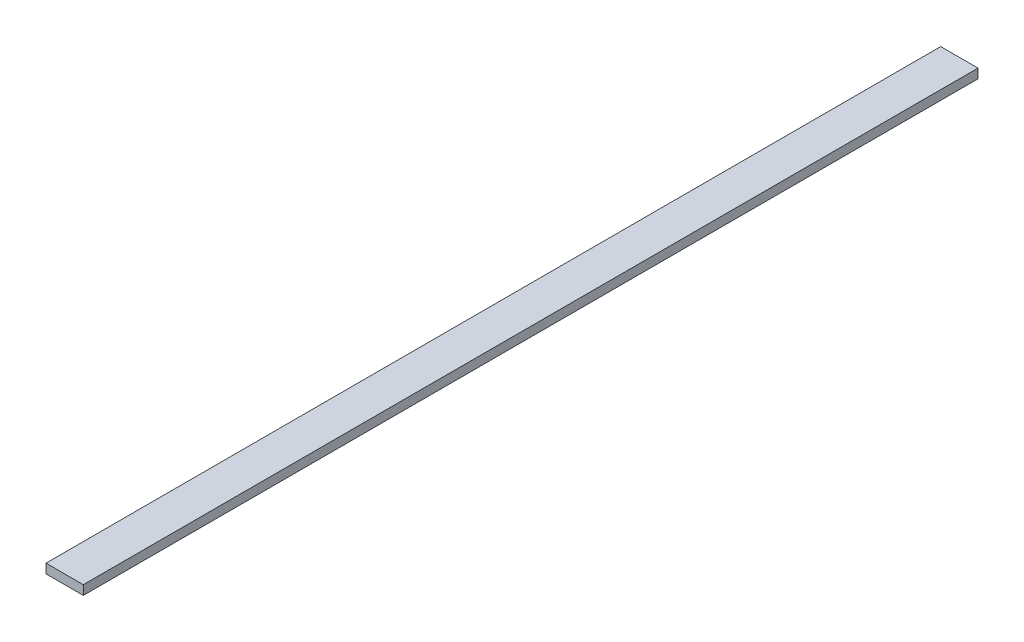
ISO-10303-21;
HEADER;
FILE_DESCRIPTION(('STEP AP214'),'2;1');
FILE_NAME('part.step','',(''),(''),'','','');
FILE_SCHEMA(('AUTOMOTIVE_DESIGN { 1 0 10303 214 1 1 1 1 }'));
ENDSEC;
DATA;
#1=APPLICATION_CONTEXT('core data for automotive mechanical design processes');
#2=APPLICATION_PROTOCOL_DEFINITION('international standard','automotive_design',2000,#1);
#3=PRODUCT_CONTEXT('',#1,'mechanical');
#4=PRODUCT('Part','Part','',(#3));
#5=PRODUCT_RELATED_PRODUCT_CATEGORY('part','',(#4));
#6=PRODUCT_DEFINITION_FORMATION('','',#4);
#7=PRODUCT_DEFINITION_CONTEXT('part definition',#1,'design');
#8=PRODUCT_DEFINITION('design','',#6,#7);
#9=PRODUCT_DEFINITION_SHAPE('','',#8);
#10=(LENGTH_UNIT() NAMED_UNIT(*) SI_UNIT(.MILLI.,.METRE.));
#11=(NAMED_UNIT(*) PLANE_ANGLE_UNIT() SI_UNIT($,.RADIAN.));
#12=(NAMED_UNIT(*) SI_UNIT($,.STERADIAN.) SOLID_ANGLE_UNIT());
#13=UNCERTAINTY_MEASURE_WITH_UNIT(LENGTH_MEASURE(1.E-05),#10,'distance_accuracy_value','');
#14=(GEOMETRIC_REPRESENTATION_CONTEXT(3) GLOBAL_UNCERTAINTY_ASSIGNED_CONTEXT((#13)) GLOBAL_UNIT_ASSIGNED_CONTEXT((#10,
#11,#12)) REPRESENTATION_CONTEXT('',''));
#15=CARTESIAN_POINT('',(0.,0.,0.));
#16=DIRECTION('',(0.,0.,1.));
#17=DIRECTION('',(1.,0.,0.));
#18=AXIS2_PLACEMENT_3D('',#15,#16,#17);
#19=CARTESIAN_POINT('',(-12.7,3.175,304.8));
#20=DIRECTION('',(1.,0.,0.));
#21=DIRECTION('',(0.,0.,-1.));
#22=AXIS2_PLACEMENT_3D('',#19,#20,#21);
#23=PLANE('',#22);
#24=DIRECTION('',(0.,0.,-1.));
#25=VECTOR('',#24,1.);
#26=CARTESIAN_POINT('',(-12.7,3.175,304.8));
#27=LINE('',#26,#25);
#28=CARTESIAN_POINT('',(-12.7,3.175,304.8));
#29=VERTEX_POINT('',#28);
#30=CARTESIAN_POINT('',(-12.7,3.175,-304.8));
#31=VERTEX_POINT('',#30);
#32=EDGE_CURVE('E91',#29,#31,#27,.T.);
#33=ORIENTED_EDGE('',*,*,#32,.T.);
#34=DIRECTION('',(0.,-1.,0.));
#35=VECTOR('',#34,1.);
#36=CARTESIAN_POINT('',(-12.7,3.175,-304.8));
#37=LINE('',#36,#35);
#38=CARTESIAN_POINT('',(-12.7,-3.175,-304.8));
#39=VERTEX_POINT('',#38);
#40=EDGE_CURVE('E86',#31,#39,#37,.T.);
#41=ORIENTED_EDGE('',*,*,#40,.T.);
#42=DIRECTION('',(0.,0.,-1.));
#43=VECTOR('',#42,1.);
#44=CARTESIAN_POINT('',(-12.7,-3.175,304.8));
#45=LINE('',#44,#43);
#46=CARTESIAN_POINT('',(-12.7,-3.175,304.8));
#47=VERTEX_POINT('',#46);
#48=EDGE_CURVE('E11',#47,#39,#45,.T.);
#49=ORIENTED_EDGE('',*,*,#48,.F.);
#50=DIRECTION('',(0.,-1.,0.));
#51=VECTOR('',#50,1.);
#52=CARTESIAN_POINT('',(-12.7,3.175,304.8));
#53=LINE('',#52,#51);
#54=EDGE_CURVE('E97',#29,#47,#53,.T.);
#55=ORIENTED_EDGE('',*,*,#54,.F.);
#56=EDGE_LOOP('',(#33,#41,#49,#55));
#57=FACE_BOUND('',#56,.T.);
#58=ADVANCED_FACE('F34',(#57),#23,.F.);
#59=CARTESIAN_POINT('',(12.7,-3.175,304.8));
#60=DIRECTION('',(0.,1.,0.));
#61=DIRECTION('',(0.,0.,1.));
#62=AXIS2_PLACEMENT_3D('',#59,#60,#61);
#63=PLANE('',#62);
#64=ORIENTED_EDGE('',*,*,#48,.T.);
#65=DIRECTION('',(1.,0.,0.));
#66=VECTOR('',#65,1.);
#67=CARTESIAN_POINT('',(12.7,-3.175,-304.8));
#68=LINE('',#67,#66);
#69=CARTESIAN_POINT('',(12.7,-3.175,-304.8));
#70=VERTEX_POINT('',#69);
#71=EDGE_CURVE('E76',#39,#70,#68,.T.);
#72=ORIENTED_EDGE('',*,*,#71,.T.);
#73=DIRECTION('',(0.,0.,-1.));
#74=VECTOR('',#73,1.);
#75=CARTESIAN_POINT('',(12.7,-3.175,304.8));
#76=LINE('',#75,#74);
#77=CARTESIAN_POINT('',(12.7,-3.175,304.8));
#78=VERTEX_POINT('',#77);
#79=EDGE_CURVE('E41',#78,#70,#76,.T.);
#80=ORIENTED_EDGE('',*,*,#79,.F.);
#81=DIRECTION('',(1.,0.,0.));
#82=VECTOR('',#81,1.);
#83=CARTESIAN_POINT('',(12.7,-3.175,304.8));
#84=LINE('',#83,#82);
#85=EDGE_CURVE('E77',#47,#78,#84,.T.);
#86=ORIENTED_EDGE('',*,*,#85,.F.);
#87=EDGE_LOOP('',(#64,#72,#80,#86));
#88=FACE_BOUND('',#87,.T.);
#89=ADVANCED_FACE('F74',(#88),#63,.F.);
#90=CARTESIAN_POINT('',(12.7,3.175,304.8));
#91=DIRECTION('',(-1.,0.,0.));
#92=DIRECTION('',(0.,0.,1.));
#93=AXIS2_PLACEMENT_3D('',#90,#91,#92);
#94=PLANE('',#93);
#95=ORIENTED_EDGE('',*,*,#79,.T.);
#96=DIRECTION('',(0.,1.,0.));
#97=VECTOR('',#96,1.);
#98=CARTESIAN_POINT('',(12.7,3.175,-304.8));
#99=LINE('',#98,#97);
#100=CARTESIAN_POINT('',(12.7,3.175,-304.8));
#101=VERTEX_POINT('',#100);
#102=EDGE_CURVE('E89',#70,#101,#99,.T.);
#103=ORIENTED_EDGE('',*,*,#102,.T.);
#104=DIRECTION('',(0.,0.,-1.));
#105=VECTOR('',#104,1.);
#106=CARTESIAN_POINT('',(12.7,3.175,304.8));
#107=LINE('',#106,#105);
#108=CARTESIAN_POINT('',(12.7,3.175,304.8));
#109=VERTEX_POINT('',#108);
#110=EDGE_CURVE('E103',#109,#101,#107,.T.);
#111=ORIENTED_EDGE('',*,*,#110,.F.);
#112=DIRECTION('',(0.,1.,0.));
#113=VECTOR('',#112,1.);
#114=CARTESIAN_POINT('',(12.7,3.175,304.8));
#115=LINE('',#114,#113);
#116=EDGE_CURVE('E53',#78,#109,#115,.T.);
#117=ORIENTED_EDGE('',*,*,#116,.F.);
#118=EDGE_LOOP('',(#95,#103,#111,#117));
#119=FACE_BOUND('',#118,.T.);
#120=ADVANCED_FACE('F105',(#119),#94,.F.);
#121=CARTESIAN_POINT('',(12.7,3.175,304.8));
#122=DIRECTION('',(0.,-1.,0.));
#123=DIRECTION('',(0.,0.,-1.));
#124=AXIS2_PLACEMENT_3D('',#121,#122,#123);
#125=PLANE('',#124);
#126=ORIENTED_EDGE('',*,*,#110,.T.);
#127=DIRECTION('',(-1.,0.,0.));
#128=VECTOR('',#127,1.);
#129=CARTESIAN_POINT('',(12.7,3.175,-304.8));
#130=LINE('',#129,#128);
#131=EDGE_CURVE('E95',#101,#31,#130,.T.);
#132=ORIENTED_EDGE('',*,*,#131,.T.);
#133=ORIENTED_EDGE('',*,*,#32,.F.);
#134=DIRECTION('',(-1.,0.,0.));
#135=VECTOR('',#134,1.);
#136=CARTESIAN_POINT('',(12.7,3.175,304.8));
#137=LINE('',#136,#135);
#138=EDGE_CURVE('E48',#109,#29,#137,.T.);
#139=ORIENTED_EDGE('',*,*,#138,.F.);
#140=EDGE_LOOP('',(#126,#132,#133,#139));
#141=FACE_BOUND('',#140,.T.);
#142=ADVANCED_FACE('F107',(#141),#125,.F.);
#143=CARTESIAN_POINT('',(0.,0.,304.8));
#144=DIRECTION('',(0.,0.,-1.));
#145=DIRECTION('',(-1.,0.,0.));
#146=AXIS2_PLACEMENT_3D('',#143,#144,#145);
#147=PLANE('',#146);
#148=ORIENTED_EDGE('',*,*,#54,.T.);
#149=ORIENTED_EDGE('',*,*,#85,.T.);
#150=ORIENTED_EDGE('',*,*,#116,.T.);
#151=ORIENTED_EDGE('',*,*,#138,.T.);
#152=EDGE_LOOP('',(#148,#149,#150,#151));
#153=FACE_BOUND('',#152,.T.);
#154=ADVANCED_FACE('F108',(#153),#147,.F.);
#155=CARTESIAN_POINT('',(0.,0.,-304.8));
#156=DIRECTION('',(0.,0.,-1.));
#157=DIRECTION('',(-1.,0.,0.));
#158=AXIS2_PLACEMENT_3D('',#155,#156,#157);
#159=PLANE('',#158);
#160=ORIENTED_EDGE('',*,*,#40,.F.);
#161=ORIENTED_EDGE('',*,*,#131,.F.);
#162=ORIENTED_EDGE('',*,*,#102,.F.);
#163=ORIENTED_EDGE('',*,*,#71,.F.);
#164=EDGE_LOOP('',(#160,#161,#162,#163));
#165=FACE_BOUND('',#164,.T.);
#166=ADVANCED_FACE('F84',(#165),#159,.T.);
#167=CLOSED_SHELL('',(#58,#89,#120,#142,#154,#166));
#168=MANIFOLD_SOLID_BREP('B2',#167);
#169=ADVANCED_BREP_SHAPE_REPRESENTATION('',(#18,#168),#14);
#170=SHAPE_DEFINITION_REPRESENTATION(#9,#169);
ENDSEC;
END-ISO-10303-21;
